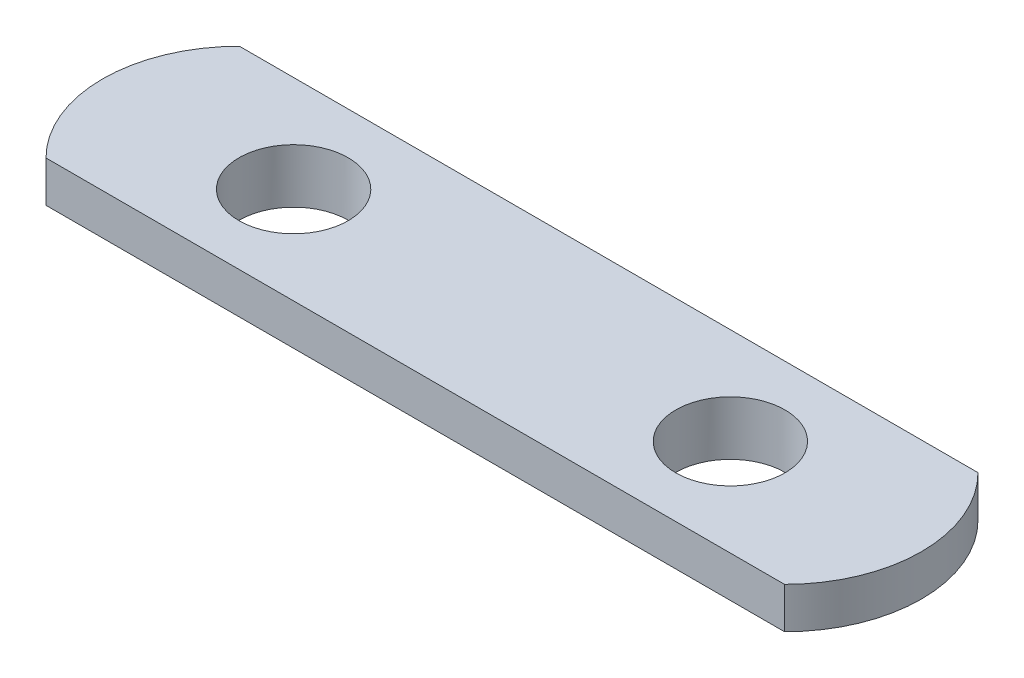
ISO-10303-21;
HEADER;
FILE_DESCRIPTION(('STEP AP214'),'2;1');
FILE_NAME('part.step','',(''),(''),'','','');
FILE_SCHEMA(('AUTOMOTIVE_DESIGN { 1 0 10303 214 1 1 1 1 }'));
ENDSEC;
DATA;
#1=APPLICATION_CONTEXT('core data for automotive mechanical design processes');
#2=APPLICATION_PROTOCOL_DEFINITION('international standard','automotive_design',2000,#1);
#3=PRODUCT_CONTEXT('',#1,'mechanical');
#4=PRODUCT('Part','Part','',(#3));
#5=PRODUCT_RELATED_PRODUCT_CATEGORY('part','',(#4));
#6=PRODUCT_DEFINITION_FORMATION('','',#4);
#7=PRODUCT_DEFINITION_CONTEXT('part definition',#1,'design');
#8=PRODUCT_DEFINITION('design','',#6,#7);
#9=PRODUCT_DEFINITION_SHAPE('','',#8);
#10=(LENGTH_UNIT() NAMED_UNIT(*) SI_UNIT(.MILLI.,.METRE.));
#11=(NAMED_UNIT(*) PLANE_ANGLE_UNIT() SI_UNIT($,.RADIAN.));
#12=(NAMED_UNIT(*) SI_UNIT($,.STERADIAN.) SOLID_ANGLE_UNIT());
#13=UNCERTAINTY_MEASURE_WITH_UNIT(LENGTH_MEASURE(1.E-05),#10,'distance_accuracy_value','');
#14=(GEOMETRIC_REPRESENTATION_CONTEXT(3) GLOBAL_UNCERTAINTY_ASSIGNED_CONTEXT((#13)) GLOBAL_UNIT_ASSIGNED_CONTEXT((#10,
#11,#12)) REPRESENTATION_CONTEXT('',''));
#15=CARTESIAN_POINT('',(0.,0.,0.));
#16=DIRECTION('',(0.,0.,1.));
#17=DIRECTION('',(1.,0.,0.));
#18=AXIS2_PLACEMENT_3D('',#15,#16,#17);
#19=CARTESIAN_POINT('',(-15.875,-8.7376,0.));
#20=DIRECTION('',(0.,1.,0.));
#21=DIRECTION('',(0.,0.,1.));
#22=AXIS2_PLACEMENT_3D('',#19,#20,#21);
#23=PLANE('',#22);
#24=CARTESIAN_POINT('',(-12.7,-8.7376,0.));
#25=DIRECTION('',(0.,1.,0.));
#26=DIRECTION('',(0.,0.,1.));
#27=AXIS2_PLACEMENT_3D('',#24,#25,#26);
#28=CIRCLE('',#27,3.5687);
#29=CARTESIAN_POINT('',(-12.7,-8.7376,3.5687));
#30=VERTEX_POINT('',#29);
#31=EDGE_CURVE('E47',#30,#30,#28,.F.);
#32=ORIENTED_EDGE('',*,*,#31,.F.);
#33=EDGE_LOOP('',(#32));
#34=FACE_BOUND('',#33,.T.);
#35=CARTESIAN_POINT('',(-15.875,-8.7376,0.));
#36=DIRECTION('',(0.,1.,0.));
#37=DIRECTION('',(0.,0.,1.));
#38=AXIS2_PLACEMENT_3D('',#35,#36,#37);
#39=CIRCLE('',#38,7.9375);
#40=CARTESIAN_POINT('',(-21.4741878911142,-8.7376,-5.6261));
#41=VERTEX_POINT('',#40);
#42=CARTESIAN_POINT('',(-21.4741878911142,-8.7376,5.6261));
#43=VERTEX_POINT('',#42);
#44=EDGE_CURVE('E100',#41,#43,#39,.T.);
#45=ORIENTED_EDGE('',*,*,#44,.F.);
#46=DIRECTION('',(-1.,0.,0.));
#47=VECTOR('',#46,1.);
#48=CARTESIAN_POINT('',(-21.4741878911142,-8.7376,-5.6261));
#49=LINE('',#48,#47);
#50=CARTESIAN_POINT('',(21.4741878911142,-8.7376,-5.6261));
#51=VERTEX_POINT('',#50);
#52=EDGE_CURVE('E97',#51,#41,#49,.T.);
#53=ORIENTED_EDGE('',*,*,#52,.F.);
#54=CARTESIAN_POINT('',(15.875,-8.7376,0.));
#55=DIRECTION('',(0.,1.,0.));
#56=DIRECTION('',(0.,0.,-1.));
#57=AXIS2_PLACEMENT_3D('',#54,#55,#56);
#58=CIRCLE('',#57,7.9375);
#59=CARTESIAN_POINT('',(21.4741878911142,-8.7376,5.6261));
#60=VERTEX_POINT('',#59);
#61=EDGE_CURVE('E89',#60,#51,#58,.T.);
#62=ORIENTED_EDGE('',*,*,#61,.F.);
#63=DIRECTION('',(1.,0.,0.));
#64=VECTOR('',#63,1.);
#65=CARTESIAN_POINT('',(-21.4741878911142,-8.7376,5.6261));
#66=LINE('',#65,#64);
#67=EDGE_CURVE('E96',#43,#60,#66,.T.);
#68=ORIENTED_EDGE('',*,*,#67,.F.);
#69=EDGE_LOOP('',(#45,#53,#62,#68));
#70=FACE_BOUND('',#69,.T.);
#71=CARTESIAN_POINT('',(12.7,-8.7376,0.));
#72=DIRECTION('',(0.,1.,0.));
#73=DIRECTION('',(0.,0.,1.));
#74=AXIS2_PLACEMENT_3D('',#71,#72,#73);
#75=CIRCLE('',#74,3.5687);
#76=CARTESIAN_POINT('',(12.7,-8.7376,3.5687));
#77=VERTEX_POINT('',#76);
#78=EDGE_CURVE('E12',#77,#77,#75,.F.);
#79=ORIENTED_EDGE('',*,*,#78,.F.);
#80=EDGE_LOOP('',(#79));
#81=FACE_BOUND('',#80,.T.);
#82=ADVANCED_FACE('F38',(#34,#70,#81),#23,.F.);
#83=CARTESIAN_POINT('',(-15.875,-8.7376,0.));
#84=DIRECTION('',(0.,1.,0.));
#85=DIRECTION('',(0.,0.,1.));
#86=AXIS2_PLACEMENT_3D('',#83,#84,#85);
#87=CYLINDRICAL_SURFACE('',#86,7.9375);
#88=CARTESIAN_POINT('',(-15.875,-6.35,0.));
#89=DIRECTION('',(0.,1.,0.));
#90=DIRECTION('',(0.,0.,1.));
#91=AXIS2_PLACEMENT_3D('',#88,#89,#90);
#92=CIRCLE('',#91,7.9375);
#93=CARTESIAN_POINT('',(-21.4741878911142,-6.35,-5.6261));
#94=VERTEX_POINT('',#93);
#95=CARTESIAN_POINT('',(-21.4741878911142,-6.35,5.6261));
#96=VERTEX_POINT('',#95);
#97=EDGE_CURVE('E107',#94,#96,#92,.T.);
#98=ORIENTED_EDGE('',*,*,#97,.F.);
#99=DIRECTION('',(0.,1.,0.));
#100=VECTOR('',#99,1.);
#101=CARTESIAN_POINT('',(-21.4741878911142,-8.7376,-5.6261));
#102=LINE('',#101,#100);
#103=EDGE_CURVE('E55',#41,#94,#102,.T.);
#104=ORIENTED_EDGE('',*,*,#103,.F.);
#105=ORIENTED_EDGE('',*,*,#44,.T.);
#106=DIRECTION('',(0.,1.,0.));
#107=VECTOR('',#106,1.);
#108=CARTESIAN_POINT('',(-21.4741878911142,-8.7376,5.6261));
#109=LINE('',#108,#107);
#110=EDGE_CURVE('E83',#43,#96,#109,.T.);
#111=ORIENTED_EDGE('',*,*,#110,.T.);
#112=EDGE_LOOP('',(#98,#104,#105,#111));
#113=FACE_BOUND('',#112,.T.);
#114=ADVANCED_FACE('F40',(#113),#87,.T.);
#115=CARTESIAN_POINT('',(-21.4741878911142,-8.7376,-5.6261));
#116=DIRECTION('',(0.,0.,-1.));
#117=DIRECTION('',(-1.,0.,0.));
#118=AXIS2_PLACEMENT_3D('',#115,#116,#117);
#119=PLANE('',#118);
#120=DIRECTION('',(-1.,0.,0.));
#121=VECTOR('',#120,1.);
#122=CARTESIAN_POINT('',(-21.4741878911142,-6.35,-5.6261));
#123=LINE('',#122,#121);
#124=CARTESIAN_POINT('',(21.4741878911142,-6.35,-5.6261));
#125=VERTEX_POINT('',#124);
#126=EDGE_CURVE('E102',#125,#94,#123,.T.);
#127=ORIENTED_EDGE('',*,*,#126,.F.);
#128=DIRECTION('',(0.,1.,0.));
#129=VECTOR('',#128,1.);
#130=CARTESIAN_POINT('',(21.4741878911142,-8.7376,-5.6261));
#131=LINE('',#130,#129);
#132=EDGE_CURVE('E72',#51,#125,#131,.T.);
#133=ORIENTED_EDGE('',*,*,#132,.F.);
#134=ORIENTED_EDGE('',*,*,#52,.T.);
#135=ORIENTED_EDGE('',*,*,#103,.T.);
#136=EDGE_LOOP('',(#127,#133,#134,#135));
#137=FACE_BOUND('',#136,.T.);
#138=ADVANCED_FACE('F128',(#137),#119,.T.);
#139=CARTESIAN_POINT('',(15.875,-8.7376,0.));
#140=DIRECTION('',(0.,1.,0.));
#141=DIRECTION('',(0.,0.,1.));
#142=AXIS2_PLACEMENT_3D('',#139,#140,#141);
#143=CYLINDRICAL_SURFACE('',#142,7.9375);
#144=CARTESIAN_POINT('',(15.875,-6.35,0.));
#145=DIRECTION('',(0.,1.,0.));
#146=DIRECTION('',(0.,0.,-1.));
#147=AXIS2_PLACEMENT_3D('',#144,#145,#146);
#148=CIRCLE('',#147,7.9375);
#149=CARTESIAN_POINT('',(21.4741878911142,-6.35,5.6261));
#150=VERTEX_POINT('',#149);
#151=EDGE_CURVE('E91',#150,#125,#148,.T.);
#152=ORIENTED_EDGE('',*,*,#151,.F.);
#153=DIRECTION('',(0.,1.,0.));
#154=VECTOR('',#153,1.);
#155=CARTESIAN_POINT('',(21.4741878911142,-8.7376,5.6261));
#156=LINE('',#155,#154);
#157=EDGE_CURVE('E86',#60,#150,#156,.T.);
#158=ORIENTED_EDGE('',*,*,#157,.F.);
#159=ORIENTED_EDGE('',*,*,#61,.T.);
#160=ORIENTED_EDGE('',*,*,#132,.T.);
#161=EDGE_LOOP('',(#152,#158,#159,#160));
#162=FACE_BOUND('',#161,.T.);
#163=ADVANCED_FACE('F88',(#162),#143,.T.);
#164=CARTESIAN_POINT('',(-21.4741878911142,-8.7376,5.6261));
#165=DIRECTION('',(0.,0.,1.));
#166=DIRECTION('',(1.,0.,0.));
#167=AXIS2_PLACEMENT_3D('',#164,#165,#166);
#168=PLANE('',#167);
#169=DIRECTION('',(1.,0.,0.));
#170=VECTOR('',#169,1.);
#171=CARTESIAN_POINT('',(-21.4741878911142,-6.35,5.6261));
#172=LINE('',#171,#170);
#173=EDGE_CURVE('E110',#96,#150,#172,.T.);
#174=ORIENTED_EDGE('',*,*,#173,.F.);
#175=ORIENTED_EDGE('',*,*,#110,.F.);
#176=ORIENTED_EDGE('',*,*,#67,.T.);
#177=ORIENTED_EDGE('',*,*,#157,.T.);
#178=EDGE_LOOP('',(#174,#175,#176,#177));
#179=FACE_BOUND('',#178,.T.);
#180=ADVANCED_FACE('F99',(#179),#168,.T.);
#181=CARTESIAN_POINT('',(-15.875,-6.35,0.));
#182=DIRECTION('',(0.,1.,0.));
#183=DIRECTION('',(0.,0.,1.));
#184=AXIS2_PLACEMENT_3D('',#181,#182,#183);
#185=PLANE('',#184);
#186=CARTESIAN_POINT('',(12.7,-6.35,0.));
#187=DIRECTION('',(0.,1.,0.));
#188=DIRECTION('',(0.,0.,1.));
#189=AXIS2_PLACEMENT_3D('',#186,#187,#188);
#190=CIRCLE('',#189,3.175);
#191=CARTESIAN_POINT('',(12.7,-6.35,3.175));
#192=VERTEX_POINT('',#191);
#193=EDGE_CURVE('E253',#192,#192,#190,.T.);
#194=ORIENTED_EDGE('',*,*,#193,.F.);
#195=EDGE_LOOP('',(#194));
#196=FACE_BOUND('',#195,.T.);
#197=CARTESIAN_POINT('',(-12.7,-6.35,0.));
#198=DIRECTION('',(0.,1.,0.));
#199=DIRECTION('',(0.,0.,1.));
#200=AXIS2_PLACEMENT_3D('',#197,#198,#199);
#201=CIRCLE('',#200,3.175);
#202=CARTESIAN_POINT('',(-12.7,-6.35,3.175));
#203=VERTEX_POINT('',#202);
#204=EDGE_CURVE('E111',#203,#203,#201,.T.);
#205=ORIENTED_EDGE('',*,*,#204,.F.);
#206=EDGE_LOOP('',(#205));
#207=FACE_BOUND('',#206,.T.);
#208=ORIENTED_EDGE('',*,*,#97,.T.);
#209=ORIENTED_EDGE('',*,*,#173,.T.);
#210=ORIENTED_EDGE('',*,*,#151,.T.);
#211=ORIENTED_EDGE('',*,*,#126,.T.);
#212=EDGE_LOOP('',(#208,#209,#210,#211));
#213=FACE_BOUND('',#212,.T.);
#214=ADVANCED_FACE('F133',(#196,#207,#213),#185,.T.);
#215=CARTESIAN_POINT('',(-12.7,-8.7376,0.));
#216=DIRECTION('',(0.,1.,0.));
#217=DIRECTION('',(0.,0.,1.));
#218=AXIS2_PLACEMENT_3D('',#215,#216,#217);
#219=CYLINDRICAL_SURFACE('',#218,3.175);
#220=ORIENTED_EDGE('',*,*,#204,.T.);
#221=EDGE_LOOP('',(#220));
#222=FACE_BOUND('',#221,.T.);
#223=CARTESIAN_POINT('',(-12.7,-9.4996,0.));
#224=DIRECTION('',(0.,-1.,0.));
#225=DIRECTION('',(0.,0.,-1.));
#226=AXIS2_PLACEMENT_3D('',#223,#224,#225);
#227=CIRCLE('',#226,3.175);
#228=CARTESIAN_POINT('',(-12.7,-9.4996,-3.175));
#229=VERTEX_POINT('',#228);
#230=EDGE_CURVE('E242',#229,#229,#227,.T.);
#231=ORIENTED_EDGE('',*,*,#230,.T.);
#232=EDGE_LOOP('',(#231));
#233=FACE_BOUND('',#232,.T.);
#234=ADVANCED_FACE('F131',(#222,#233),#219,.F.);
#235=CARTESIAN_POINT('',(12.7,-8.7376,0.));
#236=DIRECTION('',(0.,1.,0.));
#237=DIRECTION('',(0.,0.,1.));
#238=AXIS2_PLACEMENT_3D('',#235,#236,#237);
#239=CYLINDRICAL_SURFACE('',#238,3.175);
#240=ORIENTED_EDGE('',*,*,#193,.T.);
#241=EDGE_LOOP('',(#240));
#242=FACE_BOUND('',#241,.T.);
#243=CARTESIAN_POINT('',(12.7,-9.4996,0.));
#244=DIRECTION('',(0.,-1.,0.));
#245=DIRECTION('',(0.,0.,-1.));
#246=AXIS2_PLACEMENT_3D('',#243,#244,#245);
#247=CIRCLE('',#246,3.175);
#248=CARTESIAN_POINT('',(12.7,-9.4996,-3.175));
#249=VERTEX_POINT('',#248);
#250=EDGE_CURVE('E243',#249,#249,#247,.T.);
#251=ORIENTED_EDGE('',*,*,#250,.T.);
#252=EDGE_LOOP('',(#251));
#253=FACE_BOUND('',#252,.T.);
#254=ADVANCED_FACE('F155',(#242,#253),#239,.F.);
#255=CARTESIAN_POINT('',(-12.7,-9.4996,0.));
#256=DIRECTION('',(0.,-1.,0.));
#257=DIRECTION('',(0.,0.,-1.));
#258=AXIS2_PLACEMENT_3D('',#255,#256,#257);
#259=PLANE('',#258);
#260=CARTESIAN_POINT('',(-12.7,-9.4996,0.));
#261=DIRECTION('',(0.,-1.,0.));
#262=DIRECTION('',(0.,0.,-1.));
#263=AXIS2_PLACEMENT_3D('',#260,#261,#262);
#264=CIRCLE('',#263,3.5687);
#265=CARTESIAN_POINT('',(-12.7,-9.4996,3.5687));
#266=VERTEX_POINT('',#265);
#267=EDGE_CURVE('E246',#266,#266,#264,.T.);
#268=ORIENTED_EDGE('',*,*,#267,.T.);
#269=EDGE_LOOP('',(#268));
#270=FACE_BOUND('',#269,.T.);
#271=ORIENTED_EDGE('',*,*,#230,.F.);
#272=EDGE_LOOP('',(#271));
#273=FACE_BOUND('',#272,.T.);
#274=ADVANCED_FACE('F162',(#270,#273),#259,.T.);
#275=CARTESIAN_POINT('',(-12.7,-9.4996,0.));
#276=DIRECTION('',(0.,1.,0.));
#277=DIRECTION('',(0.,0.,1.));
#278=AXIS2_PLACEMENT_3D('',#275,#276,#277);
#279=CYLINDRICAL_SURFACE('',#278,3.5687);
#280=CARTESIAN_POINT('',(-12.7,-9.4996,3.5687));
#281=CARTESIAN_POINT('',(-12.7,-9.4916625,3.5687));
#282=CARTESIAN_POINT('',(-12.7,-9.483725,3.5687));
#283=CARTESIAN_POINT('',(-12.7,-9.46785,3.5687));
#284=CARTESIAN_POINT('',(-12.7,-9.4599125,3.5687));
#285=CARTESIAN_POINT('',(-12.7,-9.4440375,3.5687));
#286=CARTESIAN_POINT('',(-12.7,-9.4361,3.5687));
#287=CARTESIAN_POINT('',(-12.7,-9.420225,3.5687));
#288=CARTESIAN_POINT('',(-12.7,-9.4122875,3.5687));
#289=CARTESIAN_POINT('',(-12.7,-9.3964125,3.5687));
#290=CARTESIAN_POINT('',(-12.7,-9.388475,3.5687));
#291=CARTESIAN_POINT('',(-12.7,-9.3726,3.5687));
#292=CARTESIAN_POINT('',(-12.7,-9.3646625,3.5687));
#293=CARTESIAN_POINT('',(-12.7,-9.3487875,3.5687));
#294=CARTESIAN_POINT('',(-12.7,-9.34085,3.5687));
#295=CARTESIAN_POINT('',(-12.7,-9.324975,3.5687));
#296=CARTESIAN_POINT('',(-12.7,-9.3170375,3.5687));
#297=CARTESIAN_POINT('',(-12.7,-9.3011625,3.5687));
#298=CARTESIAN_POINT('',(-12.7,-9.293225,3.5687));
#299=CARTESIAN_POINT('',(-12.7,-9.27735,3.5687));
#300=CARTESIAN_POINT('',(-12.7,-9.2694125,3.5687));
#301=CARTESIAN_POINT('',(-12.7,-9.2535375,3.5687));
#302=CARTESIAN_POINT('',(-12.7,-9.2456,3.5687));
#303=CARTESIAN_POINT('',(-12.7,-9.229725,3.5687));
#304=CARTESIAN_POINT('',(-12.7,-9.2217875,3.5687));
#305=CARTESIAN_POINT('',(-12.7,-9.2059125,3.5687));
#306=CARTESIAN_POINT('',(-12.7,-9.197975,3.5687));
#307=CARTESIAN_POINT('',(-12.7,-9.1821,3.5687));
#308=CARTESIAN_POINT('',(-12.7,-9.1741625,3.5687));
#309=CARTESIAN_POINT('',(-12.7,-9.1582875,3.5687));
#310=CARTESIAN_POINT('',(-12.7,-9.15035,3.5687));
#311=CARTESIAN_POINT('',(-12.7,-9.134475,3.5687));
#312=CARTESIAN_POINT('',(-12.7,-9.1265375,3.5687));
#313=CARTESIAN_POINT('',(-12.7,-9.1106625,3.5687));
#314=CARTESIAN_POINT('',(-12.7,-9.102725,3.5687));
#315=CARTESIAN_POINT('',(-12.7,-9.08685,3.5687));
#316=CARTESIAN_POINT('',(-12.7,-9.0789125,3.5687));
#317=CARTESIAN_POINT('',(-12.7,-9.0630375,3.5687));
#318=CARTESIAN_POINT('',(-12.7,-9.0551,3.5687));
#319=CARTESIAN_POINT('',(-12.7,-9.039225,3.5687));
#320=CARTESIAN_POINT('',(-12.7,-9.0312875,3.5687));
#321=CARTESIAN_POINT('',(-12.7,-9.0154125,3.5687));
#322=CARTESIAN_POINT('',(-12.7,-9.007475,3.5687));
#323=CARTESIAN_POINT('',(-12.7,-8.9916,3.5687));
#324=CARTESIAN_POINT('',(-12.7,-8.9836625,3.5687));
#325=CARTESIAN_POINT('',(-12.7,-8.9677875,3.5687));
#326=CARTESIAN_POINT('',(-12.7,-8.95985,3.5687));
#327=CARTESIAN_POINT('',(-12.7,-8.943975,3.5687));
#328=CARTESIAN_POINT('',(-12.7,-8.9360375,3.5687));
#329=CARTESIAN_POINT('',(-12.7,-8.9201625,3.5687));
#330=CARTESIAN_POINT('',(-12.7,-8.912225,3.5687));
#331=CARTESIAN_POINT('',(-12.7,-8.89635,3.5687));
#332=CARTESIAN_POINT('',(-12.7,-8.8884125,3.5687));
#333=CARTESIAN_POINT('',(-12.7,-8.8725375,3.5687));
#334=CARTESIAN_POINT('',(-12.7,-8.8646,3.5687));
#335=CARTESIAN_POINT('',(-12.7,-8.848725,3.5687));
#336=CARTESIAN_POINT('',(-12.7,-8.8407875,3.5687));
#337=CARTESIAN_POINT('',(-12.7,-8.8249125,3.5687));
#338=CARTESIAN_POINT('',(-12.7,-8.816975,3.5687));
#339=CARTESIAN_POINT('',(-12.7,-8.8011,3.5687));
#340=CARTESIAN_POINT('',(-12.7,-8.7931625,3.5687));
#341=CARTESIAN_POINT('',(-12.7,-8.7772875,3.5687));
#342=CARTESIAN_POINT('',(-12.7,-8.76935,3.5687));
#343=CARTESIAN_POINT('',(-12.7,-8.753475,3.5687));
#344=CARTESIAN_POINT('',(-12.7,-8.7455375,3.5687));
#345=CARTESIAN_POINT('',(-12.7,-8.7376,3.5687));
#346=B_SPLINE_CURVE_WITH_KNOTS('',3,(#280,#281,#282,#283,#284,#285,#286,#287,#288,#289,#290,
#291,#292,#293,#294,#295,#296,#297,#298,#299,#300,#301,#302,#303,#304,#305,#306,#307,#308,#309,
#310,#311,#312,#313,#314,#315,#316,#317,#318,#319,#320,#321,#322,#323,#324,#325,#326,#327,#328,
#329,#330,#331,#332,#333,#334,#335,#336,#337,#338,#339,#340,#341,#342,#343,#344,#345),
.UNSPECIFIED.,.F.,.F.,(4,2,2,2,2,2,2,2,2,2,2,2,2,2,2,2,2,2,2,2,2,2,2,2,2,2,2,2,2,2,2,2,4),(0.,
0.0238125000000013,0.0476250000000008,0.0714375000000003,0.0952499999999998,0.119062500000001,
0.142875000000001,0.1666875,0.1905,0.214312500000001,0.238125,0.2619375,0.28575,
0.309562500000001,0.333375,0.3571875,0.380999999999999,0.404812500000001,0.428625,0.4524375,
0.476249999999999,0.500062500000001,0.523875,0.5476875,0.571499999999999,0.5953125,0.619125,
0.642937499999999,0.666749999999999,0.6905625,0.714375,0.738187499999999,0.761999999999999),.UNSPECIFIED.);
#347=EDGE_CURVE('BSEAM121',#266,#30,#346,.T.);
#348=ORIENTED_EDGE('',*,*,#267,.F.);
#349=ORIENTED_EDGE('',*,*,#31,.T.);
#350=ORIENTED_EDGE('',*,*,#347,.T.);
#351=ORIENTED_EDGE('',*,*,#347,.F.);
#352=EDGE_LOOP('',(#348,#350,#349,#351));
#353=FACE_BOUND('',#352,.T.);
#354=ADVANCED_FACE('F121',(#353),#279,.T.);
#355=CARTESIAN_POINT('',(12.7,-9.4996,0.));
#356=DIRECTION('',(0.,-1.,0.));
#357=DIRECTION('',(0.,0.,-1.));
#358=AXIS2_PLACEMENT_3D('',#355,#356,#357);
#359=PLANE('',#358);
#360=CARTESIAN_POINT('',(12.7,-9.4996,0.));
#361=DIRECTION('',(0.,-1.,0.));
#362=DIRECTION('',(0.,0.,-1.));
#363=AXIS2_PLACEMENT_3D('',#360,#361,#362);
#364=CIRCLE('',#363,3.5687);
#365=CARTESIAN_POINT('',(12.7,-9.4996,3.5687));
#366=VERTEX_POINT('',#365);
#367=EDGE_CURVE('E240',#366,#366,#364,.T.);
#368=ORIENTED_EDGE('',*,*,#367,.T.);
#369=EDGE_LOOP('',(#368));
#370=FACE_BOUND('',#369,.T.);
#371=ORIENTED_EDGE('',*,*,#250,.F.);
#372=EDGE_LOOP('',(#371));
#373=FACE_BOUND('',#372,.T.);
#374=ADVANCED_FACE('F176',(#370,#373),#359,.T.);
#375=CARTESIAN_POINT('',(12.7,-9.4996,0.));
#376=DIRECTION('',(0.,1.,0.));
#377=DIRECTION('',(0.,0.,1.));
#378=AXIS2_PLACEMENT_3D('',#375,#376,#377);
#379=CYLINDRICAL_SURFACE('',#378,3.5687);
#380=CARTESIAN_POINT('',(12.7,-9.4996,3.5687));
#381=CARTESIAN_POINT('',(12.7,-9.4916625,3.5687));
#382=CARTESIAN_POINT('',(12.7,-9.483725,3.5687));
#383=CARTESIAN_POINT('',(12.7,-9.46785,3.5687));
#384=CARTESIAN_POINT('',(12.7,-9.4599125,3.5687));
#385=CARTESIAN_POINT('',(12.7,-9.4440375,3.5687));
#386=CARTESIAN_POINT('',(12.7,-9.4361,3.5687));
#387=CARTESIAN_POINT('',(12.7,-9.420225,3.5687));
#388=CARTESIAN_POINT('',(12.7,-9.4122875,3.5687));
#389=CARTESIAN_POINT('',(12.7,-9.3964125,3.5687));
#390=CARTESIAN_POINT('',(12.7,-9.388475,3.5687));
#391=CARTESIAN_POINT('',(12.7,-9.3726,3.5687));
#392=CARTESIAN_POINT('',(12.7,-9.3646625,3.5687));
#393=CARTESIAN_POINT('',(12.7,-9.3487875,3.5687));
#394=CARTESIAN_POINT('',(12.7,-9.34085,3.5687));
#395=CARTESIAN_POINT('',(12.7,-9.324975,3.5687));
#396=CARTESIAN_POINT('',(12.7,-9.3170375,3.5687));
#397=CARTESIAN_POINT('',(12.7,-9.3011625,3.5687));
#398=CARTESIAN_POINT('',(12.7,-9.293225,3.5687));
#399=CARTESIAN_POINT('',(12.7,-9.27735,3.5687));
#400=CARTESIAN_POINT('',(12.7,-9.2694125,3.5687));
#401=CARTESIAN_POINT('',(12.7,-9.2535375,3.5687));
#402=CARTESIAN_POINT('',(12.7,-9.2456,3.5687));
#403=CARTESIAN_POINT('',(12.7,-9.229725,3.5687));
#404=CARTESIAN_POINT('',(12.7,-9.2217875,3.5687));
#405=CARTESIAN_POINT('',(12.7,-9.2059125,3.5687));
#406=CARTESIAN_POINT('',(12.7,-9.197975,3.5687));
#407=CARTESIAN_POINT('',(12.7,-9.1821,3.5687));
#408=CARTESIAN_POINT('',(12.7,-9.1741625,3.5687));
#409=CARTESIAN_POINT('',(12.7,-9.1582875,3.5687));
#410=CARTESIAN_POINT('',(12.7,-9.15035,3.5687));
#411=CARTESIAN_POINT('',(12.7,-9.134475,3.5687));
#412=CARTESIAN_POINT('',(12.7,-9.1265375,3.5687));
#413=CARTESIAN_POINT('',(12.7,-9.1106625,3.5687));
#414=CARTESIAN_POINT('',(12.7,-9.102725,3.5687));
#415=CARTESIAN_POINT('',(12.7,-9.08685,3.5687));
#416=CARTESIAN_POINT('',(12.7,-9.0789125,3.5687));
#417=CARTESIAN_POINT('',(12.7,-9.0630375,3.5687));
#418=CARTESIAN_POINT('',(12.7,-9.0551,3.5687));
#419=CARTESIAN_POINT('',(12.7,-9.039225,3.5687));
#420=CARTESIAN_POINT('',(12.7,-9.0312875,3.5687));
#421=CARTESIAN_POINT('',(12.7,-9.0154125,3.5687));
#422=CARTESIAN_POINT('',(12.7,-9.007475,3.5687));
#423=CARTESIAN_POINT('',(12.7,-8.9916,3.5687));
#424=CARTESIAN_POINT('',(12.7,-8.9836625,3.5687));
#425=CARTESIAN_POINT('',(12.7,-8.9677875,3.5687));
#426=CARTESIAN_POINT('',(12.7,-8.95985,3.5687));
#427=CARTESIAN_POINT('',(12.7,-8.943975,3.5687));
#428=CARTESIAN_POINT('',(12.7,-8.9360375,3.5687));
#429=CARTESIAN_POINT('',(12.7,-8.9201625,3.5687));
#430=CARTESIAN_POINT('',(12.7,-8.912225,3.5687));
#431=CARTESIAN_POINT('',(12.7,-8.89635,3.5687));
#432=CARTESIAN_POINT('',(12.7,-8.8884125,3.5687));
#433=CARTESIAN_POINT('',(12.7,-8.8725375,3.5687));
#434=CARTESIAN_POINT('',(12.7,-8.8646,3.5687));
#435=CARTESIAN_POINT('',(12.7,-8.848725,3.5687));
#436=CARTESIAN_POINT('',(12.7,-8.8407875,3.5687));
#437=CARTESIAN_POINT('',(12.7,-8.8249125,3.5687));
#438=CARTESIAN_POINT('',(12.7,-8.816975,3.5687));
#439=CARTESIAN_POINT('',(12.7,-8.8011,3.5687));
#440=CARTESIAN_POINT('',(12.7,-8.7931625,3.5687));
#441=CARTESIAN_POINT('',(12.7,-8.7772875,3.5687));
#442=CARTESIAN_POINT('',(12.7,-8.76935,3.5687));
#443=CARTESIAN_POINT('',(12.7,-8.753475,3.5687));
#444=CARTESIAN_POINT('',(12.7,-8.7455375,3.5687));
#445=CARTESIAN_POINT('',(12.7,-8.7376,3.5687));
#446=B_SPLINE_CURVE_WITH_KNOTS('',3,(#380,#381,#382,#383,#384,#385,#386,#387,#388,#389,#390,
#391,#392,#393,#394,#395,#396,#397,#398,#399,#400,#401,#402,#403,#404,#405,#406,#407,#408,#409,
#410,#411,#412,#413,#414,#415,#416,#417,#418,#419,#420,#421,#422,#423,#424,#425,#426,#427,#428,
#429,#430,#431,#432,#433,#434,#435,#436,#437,#438,#439,#440,#441,#442,#443,#444,#445),
.UNSPECIFIED.,.F.,.F.,(4,2,2,2,2,2,2,2,2,2,2,2,2,2,2,2,2,2,2,2,2,2,2,2,2,2,2,2,2,2,2,2,4),(0.,
0.0238125000000013,0.0476250000000008,0.0714375000000003,0.0952499999999998,0.119062500000001,
0.142875000000001,0.1666875,0.1905,0.214312500000001,0.238125,0.2619375,0.28575,
0.309562500000001,0.333375,0.3571875,0.380999999999999,0.404812500000001,0.428625,0.4524375,
0.476249999999999,0.500062500000001,0.523875,0.5476875,0.571499999999999,0.5953125,0.619125,
0.642937499999999,0.666749999999999,0.6905625,0.714375,0.738187499999999,0.761999999999999),.UNSPECIFIED.);
#447=EDGE_CURVE('BSEAM184',#366,#77,#446,.T.);
#448=ORIENTED_EDGE('',*,*,#367,.F.);
#449=ORIENTED_EDGE('',*,*,#78,.T.);
#450=ORIENTED_EDGE('',*,*,#447,.T.);
#451=ORIENTED_EDGE('',*,*,#447,.F.);
#452=EDGE_LOOP('',(#448,#450,#449,#451));
#453=FACE_BOUND('',#452,.T.);
#454=ADVANCED_FACE('F184',(#453),#379,.T.);
#455=CLOSED_SHELL('',(#82,#114,#138,#163,#180,#214,#234,#254,#274,#354,#374,#454));
#456=MANIFOLD_SOLID_BREP('B2',#455);
#457=ADVANCED_BREP_SHAPE_REPRESENTATION('',(#18,#456),#14);
#458=SHAPE_DEFINITION_REPRESENTATION(#9,#457);
ENDSEC;
END-ISO-10303-21;
